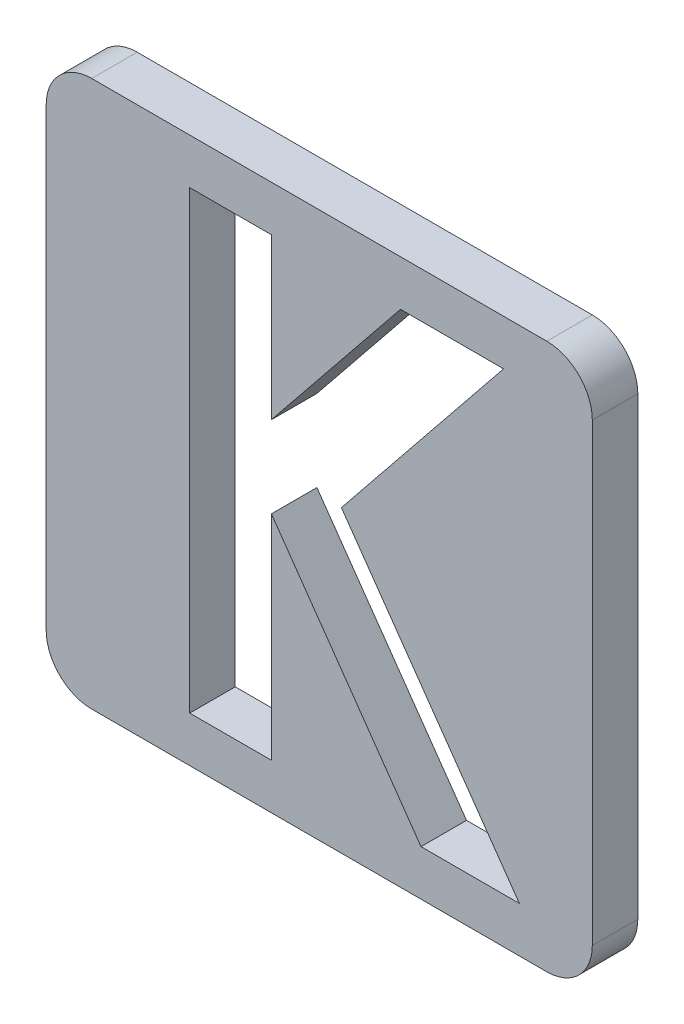
ISO-10303-21;
HEADER;
FILE_DESCRIPTION(('STEP AP214'),'2;1');
FILE_NAME('part.step','',(''),(''),'','','');
FILE_SCHEMA(('AUTOMOTIVE_DESIGN { 1 0 10303 214 1 1 1 1 }'));
ENDSEC;
DATA;
#1=APPLICATION_CONTEXT('core data for automotive mechanical design processes');
#2=APPLICATION_PROTOCOL_DEFINITION('international standard','automotive_design',2000,#1);
#3=PRODUCT_CONTEXT('',#1,'mechanical');
#4=PRODUCT('Part','Part','',(#3));
#5=PRODUCT_RELATED_PRODUCT_CATEGORY('part','',(#4));
#6=PRODUCT_DEFINITION_FORMATION('','',#4);
#7=PRODUCT_DEFINITION_CONTEXT('part definition',#1,'design');
#8=PRODUCT_DEFINITION('design','',#6,#7);
#9=PRODUCT_DEFINITION_SHAPE('','',#8);
#10=(LENGTH_UNIT() NAMED_UNIT(*) SI_UNIT(.MILLI.,.METRE.));
#11=(NAMED_UNIT(*) PLANE_ANGLE_UNIT() SI_UNIT($,.RADIAN.));
#12=(NAMED_UNIT(*) SI_UNIT($,.STERADIAN.) SOLID_ANGLE_UNIT());
#13=UNCERTAINTY_MEASURE_WITH_UNIT(LENGTH_MEASURE(1.E-05),#10,'distance_accuracy_value','');
#14=(GEOMETRIC_REPRESENTATION_CONTEXT(3) GLOBAL_UNCERTAINTY_ASSIGNED_CONTEXT((#13)) GLOBAL_UNIT_ASSIGNED_CONTEXT((#10,
#11,#12)) REPRESENTATION_CONTEXT('',''));
#15=CARTESIAN_POINT('',(0.,0.,0.));
#16=DIRECTION('',(0.,0.,1.));
#17=DIRECTION('',(1.,0.,0.));
#18=AXIS2_PLACEMENT_3D('',#15,#16,#17);
#19=CARTESIAN_POINT('',(50.,50.,10.));
#20=DIRECTION('',(0.,0.,-1.));
#21=DIRECTION('',(-1.,0.,0.));
#22=AXIS2_PLACEMENT_3D('',#19,#20,#21);
#23=PLANE('',#22);
#24=DIRECTION('',(1.,0.,0.));
#25=VECTOR('',#24,1.);
#26=CARTESIAN_POINT('',(-49.9999999999999,60.,10.));
#27=LINE('',#26,#25);
#28=CARTESIAN_POINT('',(-49.9999999999999,60.,10.));
#29=VERTEX_POINT('',#28);
#30=CARTESIAN_POINT('',(49.9999999999999,60.,10.));
#31=VERTEX_POINT('',#30);
#32=EDGE_CURVE('E252',#29,#31,#27,.T.);
#33=ORIENTED_EDGE('',*,*,#32,.F.);
#34=CARTESIAN_POINT('',(-50.,50.,10.));
#35=DIRECTION('',(0.,0.,1.));
#36=DIRECTION('',(1.,0.,0.));
#37=AXIS2_PLACEMENT_3D('',#34,#35,#36);
#38=CIRCLE('',#37,10.);
#39=CARTESIAN_POINT('',(-60.,49.9999999999999,10.));
#40=VERTEX_POINT('',#39);
#41=EDGE_CURVE('E270',#29,#40,#38,.T.);
#42=ORIENTED_EDGE('',*,*,#41,.T.);
#43=DIRECTION('',(0.,-1.,0.));
#44=VECTOR('',#43,1.);
#45=CARTESIAN_POINT('',(-60.,49.9999999999999,10.));
#46=LINE('',#45,#44);
#47=CARTESIAN_POINT('',(-60.,-49.9999999999999,10.));
#48=VERTEX_POINT('',#47);
#49=EDGE_CURVE('E268',#40,#48,#46,.T.);
#50=ORIENTED_EDGE('',*,*,#49,.T.);
#51=CARTESIAN_POINT('',(-50.,-50.,10.));
#52=DIRECTION('',(0.,0.,1.));
#53=DIRECTION('',(1.,0.,0.));
#54=AXIS2_PLACEMENT_3D('',#51,#52,#53);
#55=CIRCLE('',#54,10.);
#56=CARTESIAN_POINT('',(-49.9999999999999,-60.,10.));
#57=VERTEX_POINT('',#56);
#58=EDGE_CURVE('E266',#48,#57,#55,.T.);
#59=ORIENTED_EDGE('',*,*,#58,.T.);
#60=DIRECTION('',(1.,0.,0.));
#61=VECTOR('',#60,1.);
#62=CARTESIAN_POINT('',(-49.9999999999999,-60.,10.));
#63=LINE('',#62,#61);
#64=CARTESIAN_POINT('',(49.9999999999999,-60.,10.));
#65=VERTEX_POINT('',#64);
#66=EDGE_CURVE('E264',#57,#65,#63,.T.);
#67=ORIENTED_EDGE('',*,*,#66,.T.);
#68=CARTESIAN_POINT('',(50.,-50.,10.));
#69=DIRECTION('',(0.,0.,1.));
#70=DIRECTION('',(1.,0.,0.));
#71=AXIS2_PLACEMENT_3D('',#68,#69,#70);
#72=CIRCLE('',#71,10.);
#73=CARTESIAN_POINT('',(60.,-50.,10.));
#74=VERTEX_POINT('',#73);
#75=EDGE_CURVE('E262',#65,#74,#72,.T.);
#76=ORIENTED_EDGE('',*,*,#75,.T.);
#77=DIRECTION('',(0.,-1.,0.));
#78=VECTOR('',#77,1.);
#79=CARTESIAN_POINT('',(60.,49.9999999999999,10.));
#80=LINE('',#79,#78);
#81=CARTESIAN_POINT('',(60.,49.9999999999999,10.));
#82=VERTEX_POINT('',#81);
#83=EDGE_CURVE('E259',#82,#74,#80,.T.);
#84=ORIENTED_EDGE('',*,*,#83,.F.);
#85=CARTESIAN_POINT('',(50.,50.,10.));
#86=DIRECTION('',(0.,0.,-1.));
#87=DIRECTION('',(-1.,0.,0.));
#88=AXIS2_PLACEMENT_3D('',#85,#86,#87);
#89=CIRCLE('',#88,10.);
#90=EDGE_CURVE('E255',#31,#82,#89,.T.);
#91=ORIENTED_EDGE('',*,*,#90,.F.);
#92=EDGE_LOOP('',(#33,#42,#50,#59,#67,#76,#84,#91));
#93=FACE_BOUND('',#92,.T.);
#94=DIRECTION('',(0.,1.,0.));
#95=VECTOR('',#94,1.);
#96=CARTESIAN_POINT('',(-28.4615384615385,-50.,10.));
#97=LINE('',#96,#95);
#98=CARTESIAN_POINT('',(-28.4615384615385,-50.,10.));
#99=VERTEX_POINT('',#98);
#100=CARTESIAN_POINT('',(-28.4615384615385,50.,10.));
#101=VERTEX_POINT('',#100);
#102=EDGE_CURVE('E50',#99,#101,#97,.T.);
#103=ORIENTED_EDGE('',*,*,#102,.T.);
#104=DIRECTION('',(1.,0.,0.));
#105=VECTOR('',#104,1.);
#106=CARTESIAN_POINT('',(-28.4615384615385,50.,10.));
#107=LINE('',#106,#105);
#108=CARTESIAN_POINT('',(-10.5128205128205,50.,10.));
#109=VERTEX_POINT('',#108);
#110=EDGE_CURVE('E180',#101,#109,#107,.T.);
#111=ORIENTED_EDGE('',*,*,#110,.T.);
#112=DIRECTION('',(0.,-1.,0.));
#113=VECTOR('',#112,1.);
#114=CARTESIAN_POINT('',(-10.5128205128205,50.,10.));
#115=LINE('',#114,#113);
#116=CARTESIAN_POINT('',(-10.5128205128205,14.8036858974359,10.));
#117=VERTEX_POINT('',#116);
#118=EDGE_CURVE('E209',#109,#117,#115,.T.);
#119=ORIENTED_EDGE('',*,*,#118,.T.);
#120=DIRECTION('',(0.627501225330358,0.778615574085761,0.));
#121=VECTOR('',#120,1.);
#122=CARTESIAN_POINT('',(-10.5128205128205,14.8036858974359,10.));
#123=LINE('',#122,#121);
#124=CARTESIAN_POINT('',(17.8525641025641,50.,10.));
#125=VERTEX_POINT('',#124);
#126=EDGE_CURVE('E212',#117,#125,#123,.T.);
#127=ORIENTED_EDGE('',*,*,#126,.T.);
#128=DIRECTION('',(1.,0.,0.));
#129=VECTOR('',#128,1.);
#130=CARTESIAN_POINT('',(17.8525641025641,50.,10.));
#131=LINE('',#130,#129);
#132=CARTESIAN_POINT('',(40.5088141025641,50.,10.));
#133=VERTEX_POINT('',#132);
#134=EDGE_CURVE('E215',#125,#133,#131,.T.);
#135=ORIENTED_EDGE('',*,*,#134,.T.);
#136=DIRECTION('',(-0.627400828485831,-0.778696475152734,0.));
#137=VECTOR('',#136,1.);
#138=CARTESIAN_POINT('',(40.5088141025641,50.,10.));
#139=LINE('',#138,#137);
#140=CARTESIAN_POINT('',(4.87179487179487,5.76923076923077,10.));
#141=VERTEX_POINT('',#140);
#142=EDGE_CURVE('E218',#133,#141,#139,.T.);
#143=ORIENTED_EDGE('',*,*,#142,.T.);
#144=DIRECTION('',(0.574093809748456,-0.818789531936323,0.));
#145=VECTOR('',#144,1.);
#146=CARTESIAN_POINT('',(4.87179487179487,5.76923076923077,10.));
#147=LINE('',#146,#145);
#148=CARTESIAN_POINT('',(43.974358974359,-50.,10.));
#149=VERTEX_POINT('',#148);
#150=EDGE_CURVE('E221',#141,#149,#147,.T.);
#151=ORIENTED_EDGE('',*,*,#150,.T.);
#152=DIRECTION('',(-1.,0.,0.));
#153=VECTOR('',#152,1.);
#154=CARTESIAN_POINT('',(43.974358974359,-50.,10.));
#155=LINE('',#154,#153);
#156=CARTESIAN_POINT('',(22.3597756410256,-50.,10.));
#157=VERTEX_POINT('',#156);
#158=EDGE_CURVE('E224',#149,#157,#155,.T.);
#159=ORIENTED_EDGE('',*,*,#158,.T.);
#160=DIRECTION('',(-0.574002161068284,0.818853783705577,0.));
#161=VECTOR('',#160,1.);
#162=CARTESIAN_POINT('',(22.3597756410256,-50.,10.));
#163=LINE('',#162,#161);
#164=CARTESIAN_POINT('',(-10.5128205128205,-3.10496794871795,10.));
#165=VERTEX_POINT('',#164);
#166=EDGE_CURVE('E227',#157,#165,#163,.T.);
#167=ORIENTED_EDGE('',*,*,#166,.T.);
#168=DIRECTION('',(0.,-1.,0.));
#169=VECTOR('',#168,1.);
#170=CARTESIAN_POINT('',(-10.5128205128205,-3.10496794871795,10.));
#171=LINE('',#170,#169);
#172=CARTESIAN_POINT('',(-10.5128205128205,-50.,10.));
#173=VERTEX_POINT('',#172);
#174=EDGE_CURVE('E230',#165,#173,#171,.T.);
#175=ORIENTED_EDGE('',*,*,#174,.T.);
#176=DIRECTION('',(-1.,0.,0.));
#177=VECTOR('',#176,1.);
#178=CARTESIAN_POINT('',(-10.5128205128205,-50.,10.));
#179=LINE('',#178,#177);
#180=EDGE_CURVE('E174',#173,#99,#179,.T.);
#181=ORIENTED_EDGE('',*,*,#180,.T.);
#182=EDGE_LOOP('',(#103,#111,#119,#127,#135,#143,#151,#159,#167,#175,#181));
#183=FACE_BOUND('',#182,.T.);
#184=ADVANCED_FACE('F33',(#93,#183),#23,.F.);
#185=CARTESIAN_POINT('',(50.,50.,0.));
#186=DIRECTION('',(0.,0.,-1.));
#187=DIRECTION('',(-1.,0.,0.));
#188=AXIS2_PLACEMENT_3D('',#185,#186,#187);
#189=PLANE('',#188);
#190=DIRECTION('',(1.,0.,0.));
#191=VECTOR('',#190,1.);
#192=CARTESIAN_POINT('',(-49.9999999999999,60.,0.));
#193=LINE('',#192,#191);
#194=CARTESIAN_POINT('',(-49.9999999999999,60.,0.));
#195=VERTEX_POINT('',#194);
#196=CARTESIAN_POINT('',(49.9999999999999,60.,0.));
#197=VERTEX_POINT('',#196);
#198=EDGE_CURVE('E181',#195,#197,#193,.T.);
#199=ORIENTED_EDGE('',*,*,#198,.T.);
#200=CARTESIAN_POINT('',(50.,50.,0.));
#201=DIRECTION('',(0.,0.,-1.));
#202=DIRECTION('',(-1.,0.,0.));
#203=AXIS2_PLACEMENT_3D('',#200,#201,#202);
#204=CIRCLE('',#203,10.);
#205=CARTESIAN_POINT('',(60.,49.9999999999999,0.));
#206=VERTEX_POINT('',#205);
#207=EDGE_CURVE('E274',#197,#206,#204,.T.);
#208=ORIENTED_EDGE('',*,*,#207,.T.);
#209=DIRECTION('',(0.,-1.,0.));
#210=VECTOR('',#209,1.);
#211=CARTESIAN_POINT('',(60.,49.9999999999999,0.));
#212=LINE('',#211,#210);
#213=CARTESIAN_POINT('',(60.,-50.,0.));
#214=VERTEX_POINT('',#213);
#215=EDGE_CURVE('E277',#206,#214,#212,.T.);
#216=ORIENTED_EDGE('',*,*,#215,.T.);
#217=CARTESIAN_POINT('',(50.,-50.,0.));
#218=DIRECTION('',(0.,0.,1.));
#219=DIRECTION('',(1.,0.,0.));
#220=AXIS2_PLACEMENT_3D('',#217,#218,#219);
#221=CIRCLE('',#220,10.);
#222=CARTESIAN_POINT('',(49.9999999999999,-60.,0.));
#223=VERTEX_POINT('',#222);
#224=EDGE_CURVE('E280',#223,#214,#221,.T.);
#225=ORIENTED_EDGE('',*,*,#224,.F.);
#226=DIRECTION('',(1.,0.,0.));
#227=VECTOR('',#226,1.);
#228=CARTESIAN_POINT('',(-49.9999999999999,-60.,0.));
#229=LINE('',#228,#227);
#230=CARTESIAN_POINT('',(-49.9999999999999,-60.,0.));
#231=VERTEX_POINT('',#230);
#232=EDGE_CURVE('E283',#231,#223,#229,.T.);
#233=ORIENTED_EDGE('',*,*,#232,.F.);
#234=CARTESIAN_POINT('',(-50.,-50.,0.));
#235=DIRECTION('',(0.,0.,1.));
#236=DIRECTION('',(1.,0.,0.));
#237=AXIS2_PLACEMENT_3D('',#234,#235,#236);
#238=CIRCLE('',#237,10.);
#239=CARTESIAN_POINT('',(-60.,-49.9999999999999,0.));
#240=VERTEX_POINT('',#239);
#241=EDGE_CURVE('E285',#240,#231,#238,.T.);
#242=ORIENTED_EDGE('',*,*,#241,.F.);
#243=DIRECTION('',(0.,-1.,0.));
#244=VECTOR('',#243,1.);
#245=CARTESIAN_POINT('',(-60.,49.9999999999999,0.));
#246=LINE('',#245,#244);
#247=CARTESIAN_POINT('',(-60.,49.9999999999999,0.));
#248=VERTEX_POINT('',#247);
#249=EDGE_CURVE('E287',#248,#240,#246,.T.);
#250=ORIENTED_EDGE('',*,*,#249,.F.);
#251=CARTESIAN_POINT('',(-50.,50.,0.));
#252=DIRECTION('',(0.,0.,1.));
#253=DIRECTION('',(1.,0.,0.));
#254=AXIS2_PLACEMENT_3D('',#251,#252,#253);
#255=CIRCLE('',#254,10.);
#256=EDGE_CURVE('E256',#195,#248,#255,.T.);
#257=ORIENTED_EDGE('',*,*,#256,.F.);
#258=EDGE_LOOP('',(#199,#208,#216,#225,#233,#242,#250,#257));
#259=FACE_BOUND('',#258,.T.);
#260=DIRECTION('',(1.,0.,0.));
#261=VECTOR('',#260,1.);
#262=CARTESIAN_POINT('',(-28.4615384615385,50.,0.));
#263=LINE('',#262,#261);
#264=CARTESIAN_POINT('',(-28.4615384615385,50.,0.));
#265=VERTEX_POINT('',#264);
#266=CARTESIAN_POINT('',(-10.5128205128205,50.,0.));
#267=VERTEX_POINT('',#266);
#268=EDGE_CURVE('E173',#265,#267,#263,.T.);
#269=ORIENTED_EDGE('',*,*,#268,.F.);
#270=DIRECTION('',(0.,1.,0.));
#271=VECTOR('',#270,1.);
#272=CARTESIAN_POINT('',(-28.4615384615385,-50.,0.));
#273=LINE('',#272,#271);
#274=CARTESIAN_POINT('',(-28.4615384615385,-50.,0.));
#275=VERTEX_POINT('',#274);
#276=EDGE_CURVE('E165',#275,#265,#273,.T.);
#277=ORIENTED_EDGE('',*,*,#276,.F.);
#278=DIRECTION('',(-1.,0.,0.));
#279=VECTOR('',#278,1.);
#280=CARTESIAN_POINT('',(-10.5128205128205,-50.,0.));
#281=LINE('',#280,#279);
#282=CARTESIAN_POINT('',(-10.5128205128205,-50.,0.));
#283=VERTEX_POINT('',#282);
#284=EDGE_CURVE('E205',#283,#275,#281,.T.);
#285=ORIENTED_EDGE('',*,*,#284,.F.);
#286=DIRECTION('',(0.,-1.,0.));
#287=VECTOR('',#286,1.);
#288=CARTESIAN_POINT('',(-10.5128205128205,-3.10496794871795,0.));
#289=LINE('',#288,#287);
#290=CARTESIAN_POINT('',(-10.5128205128205,-3.10496794871795,0.));
#291=VERTEX_POINT('',#290);
#292=EDGE_CURVE('E203',#291,#283,#289,.T.);
#293=ORIENTED_EDGE('',*,*,#292,.F.);
#294=DIRECTION('',(-0.574002161068284,0.818853783705577,0.));
#295=VECTOR('',#294,1.);
#296=CARTESIAN_POINT('',(22.3597756410256,-50.,0.));
#297=LINE('',#296,#295);
#298=CARTESIAN_POINT('',(22.3597756410256,-50.,0.));
#299=VERTEX_POINT('',#298);
#300=EDGE_CURVE('E201',#299,#291,#297,.T.);
#301=ORIENTED_EDGE('',*,*,#300,.F.);
#302=DIRECTION('',(-1.,0.,0.));
#303=VECTOR('',#302,1.);
#304=CARTESIAN_POINT('',(43.974358974359,-50.,0.));
#305=LINE('',#304,#303);
#306=CARTESIAN_POINT('',(43.974358974359,-50.,0.));
#307=VERTEX_POINT('',#306);
#308=EDGE_CURVE('E199',#307,#299,#305,.T.);
#309=ORIENTED_EDGE('',*,*,#308,.F.);
#310=DIRECTION('',(0.574093809748456,-0.818789531936323,0.));
#311=VECTOR('',#310,1.);
#312=CARTESIAN_POINT('',(4.87179487179487,5.76923076923077,0.));
#313=LINE('',#312,#311);
#314=CARTESIAN_POINT('',(4.87179487179487,5.76923076923077,0.));
#315=VERTEX_POINT('',#314);
#316=EDGE_CURVE('E197',#315,#307,#313,.T.);
#317=ORIENTED_EDGE('',*,*,#316,.F.);
#318=DIRECTION('',(-0.627400828485831,-0.778696475152734,0.));
#319=VECTOR('',#318,1.);
#320=CARTESIAN_POINT('',(40.5088141025641,50.,0.));
#321=LINE('',#320,#319);
#322=CARTESIAN_POINT('',(40.5088141025641,50.,0.));
#323=VERTEX_POINT('',#322);
#324=EDGE_CURVE('E195',#323,#315,#321,.T.);
#325=ORIENTED_EDGE('',*,*,#324,.F.);
#326=DIRECTION('',(1.,0.,0.));
#327=VECTOR('',#326,1.);
#328=CARTESIAN_POINT('',(17.8525641025641,50.,0.));
#329=LINE('',#328,#327);
#330=CARTESIAN_POINT('',(17.8525641025641,50.,0.));
#331=VERTEX_POINT('',#330);
#332=EDGE_CURVE('E193',#331,#323,#329,.T.);
#333=ORIENTED_EDGE('',*,*,#332,.F.);
#334=DIRECTION('',(0.627501225330358,0.778615574085761,0.));
#335=VECTOR('',#334,1.);
#336=CARTESIAN_POINT('',(-10.5128205128205,14.8036858974359,0.));
#337=LINE('',#336,#335);
#338=CARTESIAN_POINT('',(-10.5128205128205,14.8036858974359,0.));
#339=VERTEX_POINT('',#338);
#340=EDGE_CURVE('E189',#339,#331,#337,.T.);
#341=ORIENTED_EDGE('',*,*,#340,.F.);
#342=DIRECTION('',(0.,-1.,0.));
#343=VECTOR('',#342,1.);
#344=CARTESIAN_POINT('',(-10.5128205128205,50.,0.));
#345=LINE('',#344,#343);
#346=EDGE_CURVE('E187',#267,#339,#345,.T.);
#347=ORIENTED_EDGE('',*,*,#346,.F.);
#348=EDGE_LOOP('',(#269,#277,#285,#293,#301,#309,#317,#325,#333,#341,#347));
#349=FACE_BOUND('',#348,.T.);
#350=ADVANCED_FACE('F185',(#259,#349),#189,.T.);
#351=CARTESIAN_POINT('',(-49.9999999999999,60.,10.));
#352=DIRECTION('',(0.,1.,0.));
#353=DIRECTION('',(0.,0.,1.));
#354=AXIS2_PLACEMENT_3D('',#351,#352,#353);
#355=PLANE('',#354);
#356=ORIENTED_EDGE('',*,*,#198,.F.);
#357=DIRECTION('',(0.,0.,-1.));
#358=VECTOR('',#357,1.);
#359=CARTESIAN_POINT('',(-49.9999999999999,60.,10.));
#360=LINE('',#359,#358);
#361=EDGE_CURVE('E11',#29,#195,#360,.T.);
#362=ORIENTED_EDGE('',*,*,#361,.F.);
#363=ORIENTED_EDGE('',*,*,#32,.T.);
#364=DIRECTION('',(0.,0.,-1.));
#365=VECTOR('',#364,1.);
#366=CARTESIAN_POINT('',(49.9999999999999,60.,10.));
#367=LINE('',#366,#365);
#368=EDGE_CURVE('E37',#31,#197,#367,.T.);
#369=ORIENTED_EDGE('',*,*,#368,.T.);
#370=EDGE_LOOP('',(#356,#362,#363,#369));
#371=FACE_BOUND('',#370,.T.);
#372=ADVANCED_FACE('F35',(#371),#355,.T.);
#373=CARTESIAN_POINT('',(-50.,50.,10.));
#374=DIRECTION('',(0.,0.,-1.));
#375=DIRECTION('',(-1.,0.,0.));
#376=AXIS2_PLACEMENT_3D('',#373,#374,#375);
#377=CYLINDRICAL_SURFACE('',#376,10.);
#378=ORIENTED_EDGE('',*,*,#256,.T.);
#379=DIRECTION('',(0.,0.,-1.));
#380=VECTOR('',#379,1.);
#381=CARTESIAN_POINT('',(-60.,49.9999999999999,10.));
#382=LINE('',#381,#380);
#383=EDGE_CURVE('E42',#40,#248,#382,.T.);
#384=ORIENTED_EDGE('',*,*,#383,.F.);
#385=ORIENTED_EDGE('',*,*,#41,.F.);
#386=ORIENTED_EDGE('',*,*,#361,.T.);
#387=EDGE_LOOP('',(#378,#384,#385,#386));
#388=FACE_BOUND('',#387,.T.);
#389=ADVANCED_FACE('F317',(#388),#377,.T.);
#390=CARTESIAN_POINT('',(-60.,49.9999999999999,10.));
#391=DIRECTION('',(1.,0.,0.));
#392=DIRECTION('',(0.,1.,0.));
#393=AXIS2_PLACEMENT_3D('',#390,#391,#392);
#394=PLANE('',#393);
#395=ORIENTED_EDGE('',*,*,#249,.T.);
#396=DIRECTION('',(0.,0.,-1.));
#397=VECTOR('',#396,1.);
#398=CARTESIAN_POINT('',(-60.,-49.9999999999999,10.));
#399=LINE('',#398,#397);
#400=EDGE_CURVE('E292',#48,#240,#399,.T.);
#401=ORIENTED_EDGE('',*,*,#400,.F.);
#402=ORIENTED_EDGE('',*,*,#49,.F.);
#403=ORIENTED_EDGE('',*,*,#383,.T.);
#404=EDGE_LOOP('',(#395,#401,#402,#403));
#405=FACE_BOUND('',#404,.T.);
#406=ADVANCED_FACE('F321',(#405),#394,.F.);
#407=CARTESIAN_POINT('',(-50.,-50.,10.));
#408=DIRECTION('',(0.,0.,-1.));
#409=DIRECTION('',(-1.,0.,0.));
#410=AXIS2_PLACEMENT_3D('',#407,#408,#409);
#411=CYLINDRICAL_SURFACE('',#410,10.);
#412=ORIENTED_EDGE('',*,*,#241,.T.);
#413=DIRECTION('',(0.,0.,-1.));
#414=VECTOR('',#413,1.);
#415=CARTESIAN_POINT('',(-49.9999999999999,-60.,10.));
#416=LINE('',#415,#414);
#417=EDGE_CURVE('E295',#57,#231,#416,.T.);
#418=ORIENTED_EDGE('',*,*,#417,.F.);
#419=ORIENTED_EDGE('',*,*,#58,.F.);
#420=ORIENTED_EDGE('',*,*,#400,.T.);
#421=EDGE_LOOP('',(#412,#418,#419,#420));
#422=FACE_BOUND('',#421,.T.);
#423=ADVANCED_FACE('F341',(#422),#411,.T.);
#424=CARTESIAN_POINT('',(-49.9999999999999,-60.,10.));
#425=DIRECTION('',(0.,1.,0.));
#426=DIRECTION('',(0.,0.,1.));
#427=AXIS2_PLACEMENT_3D('',#424,#425,#426);
#428=PLANE('',#427);
#429=ORIENTED_EDGE('',*,*,#232,.T.);
#430=DIRECTION('',(0.,0.,-1.));
#431=VECTOR('',#430,1.);
#432=CARTESIAN_POINT('',(49.9999999999999,-60.,10.));
#433=LINE('',#432,#431);
#434=EDGE_CURVE('E298',#65,#223,#433,.T.);
#435=ORIENTED_EDGE('',*,*,#434,.F.);
#436=ORIENTED_EDGE('',*,*,#66,.F.);
#437=ORIENTED_EDGE('',*,*,#417,.T.);
#438=EDGE_LOOP('',(#429,#435,#436,#437));
#439=FACE_BOUND('',#438,.T.);
#440=ADVANCED_FACE('F339',(#439),#428,.F.);
#441=CARTESIAN_POINT('',(50.,-50.,10.));
#442=DIRECTION('',(0.,0.,-1.));
#443=DIRECTION('',(-1.,0.,0.));
#444=AXIS2_PLACEMENT_3D('',#441,#442,#443);
#445=CYLINDRICAL_SURFACE('',#444,10.);
#446=ORIENTED_EDGE('',*,*,#224,.T.);
#447=DIRECTION('',(0.,0.,-1.));
#448=VECTOR('',#447,1.);
#449=CARTESIAN_POINT('',(60.,-50.,10.));
#450=LINE('',#449,#448);
#451=EDGE_CURVE('E301',#74,#214,#450,.T.);
#452=ORIENTED_EDGE('',*,*,#451,.F.);
#453=ORIENTED_EDGE('',*,*,#75,.F.);
#454=ORIENTED_EDGE('',*,*,#434,.T.);
#455=EDGE_LOOP('',(#446,#452,#453,#454));
#456=FACE_BOUND('',#455,.T.);
#457=ADVANCED_FACE('F335',(#456),#445,.T.);
#458=CARTESIAN_POINT('',(60.,49.9999999999999,10.));
#459=DIRECTION('',(1.,0.,0.));
#460=DIRECTION('',(0.,1.,0.));
#461=AXIS2_PLACEMENT_3D('',#458,#459,#460);
#462=PLANE('',#461);
#463=ORIENTED_EDGE('',*,*,#215,.F.);
#464=DIRECTION('',(0.,0.,-1.));
#465=VECTOR('',#464,1.);
#466=CARTESIAN_POINT('',(60.,49.9999999999999,10.));
#467=LINE('',#466,#465);
#468=EDGE_CURVE('E302',#82,#206,#467,.T.);
#469=ORIENTED_EDGE('',*,*,#468,.F.);
#470=ORIENTED_EDGE('',*,*,#83,.T.);
#471=ORIENTED_EDGE('',*,*,#451,.T.);
#472=EDGE_LOOP('',(#463,#469,#470,#471));
#473=FACE_BOUND('',#472,.T.);
#474=ADVANCED_FACE('F331',(#473),#462,.T.);
#475=CARTESIAN_POINT('',(50.,50.,10.));
#476=DIRECTION('',(0.,0.,-1.));
#477=DIRECTION('',(-1.,0.,0.));
#478=AXIS2_PLACEMENT_3D('',#475,#476,#477);
#479=CYLINDRICAL_SURFACE('',#478,10.);
#480=ORIENTED_EDGE('',*,*,#207,.F.);
#481=ORIENTED_EDGE('',*,*,#368,.F.);
#482=ORIENTED_EDGE('',*,*,#90,.T.);
#483=ORIENTED_EDGE('',*,*,#468,.T.);
#484=EDGE_LOOP('',(#480,#481,#482,#483));
#485=FACE_BOUND('',#484,.T.);
#486=ADVANCED_FACE('F310',(#485),#479,.T.);
#487=CARTESIAN_POINT('',(-28.4615384615385,-50.,0.));
#488=DIRECTION('',(1.,0.,0.));
#489=DIRECTION('',(0.,0.,-1.));
#490=AXIS2_PLACEMENT_3D('',#487,#488,#489);
#491=PLANE('',#490);
#492=ORIENTED_EDGE('',*,*,#102,.F.);
#493=DIRECTION('',(0.,0.,1.));
#494=VECTOR('',#493,1.);
#495=CARTESIAN_POINT('',(-28.4615384615385,-50.,0.));
#496=LINE('',#495,#494);
#497=EDGE_CURVE('E169',#275,#99,#496,.T.);
#498=ORIENTED_EDGE('',*,*,#497,.F.);
#499=ORIENTED_EDGE('',*,*,#276,.T.);
#500=DIRECTION('',(0.,0.,1.));
#501=VECTOR('',#500,1.);
#502=CARTESIAN_POINT('',(-28.4615384615385,50.,0.));
#503=LINE('',#502,#501);
#504=EDGE_CURVE('E168',#265,#101,#503,.T.);
#505=ORIENTED_EDGE('',*,*,#504,.T.);
#506=EDGE_LOOP('',(#492,#498,#499,#505));
#507=FACE_BOUND('',#506,.T.);
#508=ADVANCED_FACE('F167',(#507),#491,.T.);
#509=CARTESIAN_POINT('',(-28.4615384615385,50.,0.));
#510=DIRECTION('',(0.,-1.,0.));
#511=DIRECTION('',(0.,0.,-1.));
#512=AXIS2_PLACEMENT_3D('',#509,#510,#511);
#513=PLANE('',#512);
#514=ORIENTED_EDGE('',*,*,#110,.F.);
#515=ORIENTED_EDGE('',*,*,#504,.F.);
#516=ORIENTED_EDGE('',*,*,#268,.T.);
#517=DIRECTION('',(0.,0.,1.));
#518=VECTOR('',#517,1.);
#519=CARTESIAN_POINT('',(-10.5128205128205,50.,0.));
#520=LINE('',#519,#518);
#521=EDGE_CURVE('E182',#267,#109,#520,.T.);
#522=ORIENTED_EDGE('',*,*,#521,.T.);
#523=EDGE_LOOP('',(#514,#515,#516,#522));
#524=FACE_BOUND('',#523,.T.);
#525=ADVANCED_FACE('F177',(#524),#513,.T.);
#526=CARTESIAN_POINT('',(-10.5128205128205,50.,0.));
#527=DIRECTION('',(-1.,0.,0.));
#528=DIRECTION('',(0.,0.,1.));
#529=AXIS2_PLACEMENT_3D('',#526,#527,#528);
#530=PLANE('',#529);
#531=ORIENTED_EDGE('',*,*,#118,.F.);
#532=ORIENTED_EDGE('',*,*,#521,.F.);
#533=ORIENTED_EDGE('',*,*,#346,.T.);
#534=DIRECTION('',(0.,0.,1.));
#535=VECTOR('',#534,1.);
#536=CARTESIAN_POINT('',(-10.5128205128205,14.8036858974359,0.));
#537=LINE('',#536,#535);
#538=EDGE_CURVE('E249',#339,#117,#537,.T.);
#539=ORIENTED_EDGE('',*,*,#538,.T.);
#540=EDGE_LOOP('',(#531,#532,#533,#539));
#541=FACE_BOUND('',#540,.T.);
#542=ADVANCED_FACE('F390',(#541),#530,.T.);
#543=CARTESIAN_POINT('',(-10.5128205128205,14.8036858974359,0.));
#544=DIRECTION('',(0.778615574085761,-0.627501225330358,0.));
#545=DIRECTION('',(0.627501225330358,0.778615574085762,0.));
#546=AXIS2_PLACEMENT_3D('',#543,#544,#545);
#547=PLANE('',#546);
#548=ORIENTED_EDGE('',*,*,#126,.F.);
#549=ORIENTED_EDGE('',*,*,#538,.F.);
#550=ORIENTED_EDGE('',*,*,#340,.T.);
#551=DIRECTION('',(0.,0.,1.));
#552=VECTOR('',#551,1.);
#553=CARTESIAN_POINT('',(17.8525641025641,50.,0.));
#554=LINE('',#553,#552);
#555=EDGE_CURVE('E247',#331,#125,#554,.T.);
#556=ORIENTED_EDGE('',*,*,#555,.T.);
#557=EDGE_LOOP('',(#548,#549,#550,#556));
#558=FACE_BOUND('',#557,.T.);
#559=ADVANCED_FACE('F398',(#558),#547,.T.);
#560=CARTESIAN_POINT('',(17.8525641025641,50.,0.));
#561=DIRECTION('',(0.,-1.,0.));
#562=DIRECTION('',(0.,0.,-1.));
#563=AXIS2_PLACEMENT_3D('',#560,#561,#562);
#564=PLANE('',#563);
#565=ORIENTED_EDGE('',*,*,#134,.F.);
#566=ORIENTED_EDGE('',*,*,#555,.F.);
#567=ORIENTED_EDGE('',*,*,#332,.T.);
#568=DIRECTION('',(0.,0.,1.));
#569=VECTOR('',#568,1.);
#570=CARTESIAN_POINT('',(40.5088141025641,50.,0.));
#571=LINE('',#570,#569);
#572=EDGE_CURVE('E245',#323,#133,#571,.T.);
#573=ORIENTED_EDGE('',*,*,#572,.T.);
#574=EDGE_LOOP('',(#565,#566,#567,#573));
#575=FACE_BOUND('',#574,.T.);
#576=ADVANCED_FACE('F408',(#575),#564,.T.);
#577=CARTESIAN_POINT('',(40.5088141025641,50.,0.));
#578=DIRECTION('',(-0.778696475152734,0.627400828485831,0.));
#579=DIRECTION('',(-0.627400828485831,-0.778696475152735,0.));
#580=AXIS2_PLACEMENT_3D('',#577,#578,#579);
#581=PLANE('',#580);
#582=ORIENTED_EDGE('',*,*,#142,.F.);
#583=ORIENTED_EDGE('',*,*,#572,.F.);
#584=ORIENTED_EDGE('',*,*,#324,.T.);
#585=DIRECTION('',(0.,0.,1.));
#586=VECTOR('',#585,1.);
#587=CARTESIAN_POINT('',(4.87179487179487,5.76923076923077,0.));
#588=LINE('',#587,#586);
#589=EDGE_CURVE('E243',#315,#141,#588,.T.);
#590=ORIENTED_EDGE('',*,*,#589,.T.);
#591=EDGE_LOOP('',(#582,#583,#584,#590));
#592=FACE_BOUND('',#591,.T.);
#593=ADVANCED_FACE('F418',(#592),#581,.T.);
#594=CARTESIAN_POINT('',(4.87179487179487,5.76923076923077,0.));
#595=DIRECTION('',(-0.818789531936323,-0.574093809748456,0.));
#596=DIRECTION('',(0.574093809748456,-0.818789531936323,0.));
#597=AXIS2_PLACEMENT_3D('',#594,#595,#596);
#598=PLANE('',#597);
#599=ORIENTED_EDGE('',*,*,#150,.F.);
#600=ORIENTED_EDGE('',*,*,#589,.F.);
#601=ORIENTED_EDGE('',*,*,#316,.T.);
#602=DIRECTION('',(0.,0.,1.));
#603=VECTOR('',#602,1.);
#604=CARTESIAN_POINT('',(43.974358974359,-50.,0.));
#605=LINE('',#604,#603);
#606=EDGE_CURVE('E241',#307,#149,#605,.T.);
#607=ORIENTED_EDGE('',*,*,#606,.T.);
#608=EDGE_LOOP('',(#599,#600,#601,#607));
#609=FACE_BOUND('',#608,.T.);
#610=ADVANCED_FACE('F428',(#609),#598,.T.);
#611=CARTESIAN_POINT('',(43.974358974359,-50.,0.));
#612=DIRECTION('',(0.,1.,0.));
#613=DIRECTION('',(0.,0.,1.));
#614=AXIS2_PLACEMENT_3D('',#611,#612,#613);
#615=PLANE('',#614);
#616=ORIENTED_EDGE('',*,*,#158,.F.);
#617=ORIENTED_EDGE('',*,*,#606,.F.);
#618=ORIENTED_EDGE('',*,*,#308,.T.);
#619=DIRECTION('',(0.,0.,1.));
#620=VECTOR('',#619,1.);
#621=CARTESIAN_POINT('',(22.3597756410256,-50.,0.));
#622=LINE('',#621,#620);
#623=EDGE_CURVE('E239',#299,#157,#622,.T.);
#624=ORIENTED_EDGE('',*,*,#623,.T.);
#625=EDGE_LOOP('',(#616,#617,#618,#624));
#626=FACE_BOUND('',#625,.T.);
#627=ADVANCED_FACE('F438',(#626),#615,.T.);
#628=CARTESIAN_POINT('',(22.3597756410256,-50.,0.));
#629=DIRECTION('',(0.818853783705577,0.574002161068284,0.));
#630=DIRECTION('',(-0.574002161068284,0.818853783705577,0.));
#631=AXIS2_PLACEMENT_3D('',#628,#629,#630);
#632=PLANE('',#631);
#633=ORIENTED_EDGE('',*,*,#166,.F.);
#634=ORIENTED_EDGE('',*,*,#623,.F.);
#635=ORIENTED_EDGE('',*,*,#300,.T.);
#636=DIRECTION('',(0.,0.,1.));
#637=VECTOR('',#636,1.);
#638=CARTESIAN_POINT('',(-10.5128205128205,-3.10496794871795,0.));
#639=LINE('',#638,#637);
#640=EDGE_CURVE('E237',#291,#165,#639,.T.);
#641=ORIENTED_EDGE('',*,*,#640,.T.);
#642=EDGE_LOOP('',(#633,#634,#635,#641));
#643=FACE_BOUND('',#642,.T.);
#644=ADVANCED_FACE('F448',(#643),#632,.T.);
#645=CARTESIAN_POINT('',(-10.5128205128205,-3.10496794871795,0.));
#646=DIRECTION('',(-1.,0.,0.));
#647=DIRECTION('',(0.,0.,1.));
#648=AXIS2_PLACEMENT_3D('',#645,#646,#647);
#649=PLANE('',#648);
#650=ORIENTED_EDGE('',*,*,#174,.F.);
#651=ORIENTED_EDGE('',*,*,#640,.F.);
#652=ORIENTED_EDGE('',*,*,#292,.T.);
#653=DIRECTION('',(0.,0.,1.));
#654=VECTOR('',#653,1.);
#655=CARTESIAN_POINT('',(-10.5128205128205,-50.,0.));
#656=LINE('',#655,#654);
#657=EDGE_CURVE('E58',#283,#173,#656,.T.);
#658=ORIENTED_EDGE('',*,*,#657,.T.);
#659=EDGE_LOOP('',(#650,#651,#652,#658));
#660=FACE_BOUND('',#659,.T.);
#661=ADVANCED_FACE('F458',(#660),#649,.T.);
#662=CARTESIAN_POINT('',(-10.5128205128205,-50.,0.));
#663=DIRECTION('',(0.,1.,0.));
#664=DIRECTION('',(0.,0.,1.));
#665=AXIS2_PLACEMENT_3D('',#662,#663,#664);
#666=PLANE('',#665);
#667=ORIENTED_EDGE('',*,*,#180,.F.);
#668=ORIENTED_EDGE('',*,*,#657,.F.);
#669=ORIENTED_EDGE('',*,*,#284,.T.);
#670=ORIENTED_EDGE('',*,*,#497,.T.);
#671=EDGE_LOOP('',(#667,#668,#669,#670));
#672=FACE_BOUND('',#671,.T.);
#673=ADVANCED_FACE('F468',(#672),#666,.T.);
#674=CLOSED_SHELL('',(#184,#350,#372,#389,#406,#423,#440,#457,#474,#486,#508,#525,#542,#559,
#576,#593,#610,#627,#644,#661,#673));
#675=MANIFOLD_SOLID_BREP('B2',#674);
#676=ADVANCED_BREP_SHAPE_REPRESENTATION('',(#18,#675),#14);
#677=SHAPE_DEFINITION_REPRESENTATION(#9,#676);
ENDSEC;
END-ISO-10303-21;
